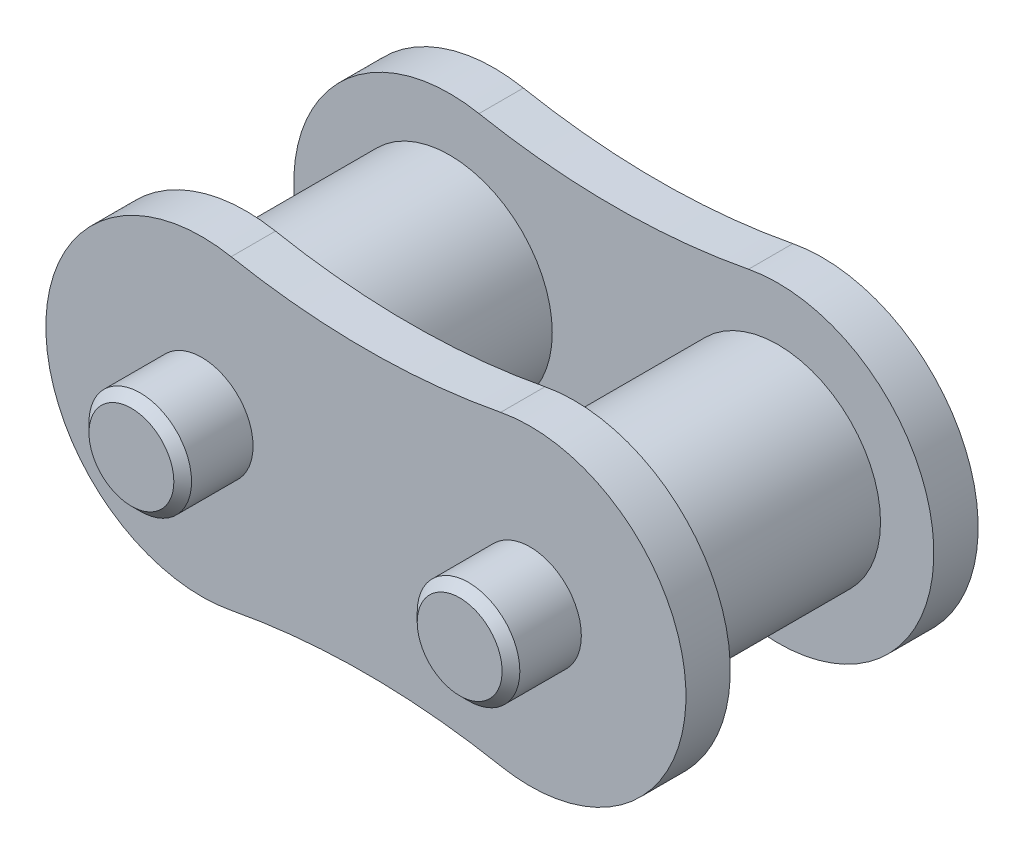
ISO-10303-21;
HEADER;
FILE_DESCRIPTION(('STEP AP214'),'2;1');
FILE_NAME('part.step','',(''),(''),'','','');
FILE_SCHEMA(('AUTOMOTIVE_DESIGN { 1 0 10303 214 1 1 1 1 }'));
ENDSEC;
DATA;
#1=APPLICATION_CONTEXT('core data for automotive mechanical design processes');
#2=APPLICATION_PROTOCOL_DEFINITION('international standard','automotive_design',2000,#1);
#3=PRODUCT_CONTEXT('',#1,'mechanical');
#4=PRODUCT('Part','Part','',(#3));
#5=PRODUCT_RELATED_PRODUCT_CATEGORY('part','',(#4));
#6=PRODUCT_DEFINITION_FORMATION('','',#4);
#7=PRODUCT_DEFINITION_CONTEXT('part definition',#1,'design');
#8=PRODUCT_DEFINITION('design','',#6,#7);
#9=PRODUCT_DEFINITION_SHAPE('','',#8);
#10=(LENGTH_UNIT() NAMED_UNIT(*) SI_UNIT(.MILLI.,.METRE.));
#11=(NAMED_UNIT(*) PLANE_ANGLE_UNIT() SI_UNIT($,.RADIAN.));
#12=(NAMED_UNIT(*) SI_UNIT($,.STERADIAN.) SOLID_ANGLE_UNIT());
#13=UNCERTAINTY_MEASURE_WITH_UNIT(LENGTH_MEASURE(1.E-05),#10,'distance_accuracy_value','');
#14=(GEOMETRIC_REPRESENTATION_CONTEXT(3) GLOBAL_UNCERTAINTY_ASSIGNED_CONTEXT((#13)) GLOBAL_UNIT_ASSIGNED_CONTEXT((#10,
#11,#12)) REPRESENTATION_CONTEXT('',''));
#15=CARTESIAN_POINT('',(0.,0.,0.));
#16=DIRECTION('',(0.,0.,1.));
#17=DIRECTION('',(1.,0.,0.));
#18=AXIS2_PLACEMENT_3D('',#15,#16,#17);
#19=CARTESIAN_POINT('',(-6.35,-33.119427631579,7.875));
#20=DIRECTION('',(0.,0.,1.));
#21=DIRECTION('',(1.,0.,0.));
#22=AXIS2_PLACEMENT_3D('',#19,#20,#21);
#23=PLANE('',#22);
#24=CARTESIAN_POINT('',(12.7,0.,7.875));
#25=DIRECTION('',(0.,0.,1.));
#26=DIRECTION('',(1.,0.,0.));
#27=AXIS2_PLACEMENT_3D('',#24,#25,#26);
#28=CIRCLE('',#27,7.94);
#29=CARTESIAN_POINT('',(20.64,0.,7.875));
#30=VERTEX_POINT('',#29);
#31=EDGE_CURVE('E176',#30,#30,#28,.T.);
#32=ORIENTED_EDGE('',*,*,#31,.T.);
#33=EDGE_LOOP('',(#32));
#34=FACE_BOUND('',#33,.T.);
#35=CARTESIAN_POINT('',(0.,-66.238855263158,7.875));
#36=DIRECTION('',(0.,0.,-1.));
#37=DIRECTION('',(1.,0.,0.));
#38=AXIS2_PLACEMENT_3D('',#35,#36,#37);
#39=CIRCLE('',#38,55.380355263158);
#40=CARTESIAN_POINT('',(-10.4281534154258,-11.8491745744655,7.875));
#41=VERTEX_POINT('',#40);
#42=CARTESIAN_POINT('',(10.4281534154258,-11.8491745744654,7.875));
#43=VERTEX_POINT('',#42);
#44=EDGE_CURVE('E155',#41,#43,#39,.T.);
#45=ORIENTED_EDGE('',*,*,#44,.F.);
#46=CARTESIAN_POINT('',(-12.7,0.,7.875));
#47=DIRECTION('',(0.,0.,1.));
#48=DIRECTION('',(1.,0.,0.));
#49=AXIS2_PLACEMENT_3D('',#46,#47,#48);
#50=CIRCLE('',#49,12.065);
#51=CARTESIAN_POINT('',(-10.4281534154258,11.8491745744655,7.875));
#52=VERTEX_POINT('',#51);
#53=EDGE_CURVE('E71',#52,#41,#50,.T.);
#54=ORIENTED_EDGE('',*,*,#53,.F.);
#55=CARTESIAN_POINT('',(0.,66.238855263158,7.875));
#56=DIRECTION('',(0.,0.,-1.));
#57=DIRECTION('',(1.,0.,0.));
#58=AXIS2_PLACEMENT_3D('',#55,#56,#57);
#59=CIRCLE('',#58,55.380355263158);
#60=CARTESIAN_POINT('',(10.4281534154258,11.8491745744655,7.875));
#61=VERTEX_POINT('',#60);
#62=EDGE_CURVE('E65',#61,#52,#59,.T.);
#63=ORIENTED_EDGE('',*,*,#62,.F.);
#64=CARTESIAN_POINT('',(12.7,0.,7.875));
#65=DIRECTION('',(0.,0.,1.));
#66=DIRECTION('',(1.,0.,0.));
#67=AXIS2_PLACEMENT_3D('',#64,#65,#66);
#68=CIRCLE('',#67,12.065);
#69=EDGE_CURVE('E165',#43,#61,#68,.T.);
#70=ORIENTED_EDGE('',*,*,#69,.F.);
#71=EDGE_LOOP('',(#45,#54,#63,#70));
#72=FACE_BOUND('',#71,.T.);
#73=CARTESIAN_POINT('',(-12.7,0.,7.875));
#74=DIRECTION('',(0.,0.,1.));
#75=DIRECTION('',(1.,0.,0.));
#76=AXIS2_PLACEMENT_3D('',#73,#74,#75);
#77=CIRCLE('',#76,7.94);
#78=CARTESIAN_POINT('',(-4.76,0.,7.875));
#79=VERTEX_POINT('',#78);
#80=EDGE_CURVE('E179',#79,#79,#77,.F.);
#81=ORIENTED_EDGE('',*,*,#80,.F.);
#82=EDGE_LOOP('',(#81));
#83=FACE_BOUND('',#82,.T.);
#84=ADVANCED_FACE('F30',(#34,#72,#83),#23,.F.);
#85=CARTESIAN_POINT('',(12.7,0.,7.875));
#86=DIRECTION('',(0.,0.,-1.));
#87=DIRECTION('',(-1.,0.,0.));
#88=AXIS2_PLACEMENT_3D('',#85,#86,#87);
#89=CYLINDRICAL_SURFACE('',#88,7.94);
#90=ORIENTED_EDGE('',*,*,#31,.F.);
#91=EDGE_LOOP('',(#90));
#92=FACE_BOUND('',#91,.T.);
#93=CARTESIAN_POINT('',(12.7,0.,-7.875));
#94=DIRECTION('',(0.,0.,-1.));
#95=DIRECTION('',(-1.,0.,0.));
#96=AXIS2_PLACEMENT_3D('',#93,#94,#95);
#97=CIRCLE('',#96,7.94);
#98=CARTESIAN_POINT('',(4.76,0.,-7.875));
#99=VERTEX_POINT('',#98);
#100=EDGE_CURVE('E152',#99,#99,#97,.T.);
#101=ORIENTED_EDGE('',*,*,#100,.F.);
#102=EDGE_LOOP('',(#101));
#103=FACE_BOUND('',#102,.T.);
#104=ADVANCED_FACE('F222',(#92,#103),#89,.T.);
#105=CARTESIAN_POINT('',(0.,-66.238855263158,11.305));
#106=DIRECTION('',(0.,0.,-1.));
#107=DIRECTION('',(-1.,0.,0.));
#108=AXIS2_PLACEMENT_3D('',#105,#106,#107);
#109=CYLINDRICAL_SURFACE('',#108,55.380355263158);
#110=ORIENTED_EDGE('',*,*,#44,.T.);
#111=DIRECTION('',(0.,0.,-1.));
#112=VECTOR('',#111,1.);
#113=CARTESIAN_POINT('',(10.4281534154258,-11.8491745744654,11.305));
#114=LINE('',#113,#112);
#115=CARTESIAN_POINT('',(10.4281534154258,-11.8491745744654,11.305));
#116=VERTEX_POINT('',#115);
#117=EDGE_CURVE('E174',#116,#43,#114,.T.);
#118=ORIENTED_EDGE('',*,*,#117,.F.);
#119=CARTESIAN_POINT('',(0.,-66.238855263158,11.305));
#120=DIRECTION('',(0.,0.,-1.));
#121=DIRECTION('',(1.,0.,0.));
#122=AXIS2_PLACEMENT_3D('',#119,#120,#121);
#123=CIRCLE('',#122,55.380355263158);
#124=CARTESIAN_POINT('',(-10.4281534154258,-11.8491745744655,11.305));
#125=VERTEX_POINT('',#124);
#126=EDGE_CURVE('E156',#125,#116,#123,.T.);
#127=ORIENTED_EDGE('',*,*,#126,.F.);
#128=DIRECTION('',(0.,0.,-1.));
#129=VECTOR('',#128,1.);
#130=CARTESIAN_POINT('',(-10.4281534154258,-11.8491745744655,11.305));
#131=LINE('',#130,#129);
#132=EDGE_CURVE('E162',#125,#41,#131,.T.);
#133=ORIENTED_EDGE('',*,*,#132,.T.);
#134=EDGE_LOOP('',(#110,#118,#127,#133));
#135=FACE_BOUND('',#134,.T.);
#136=ADVANCED_FACE('F228',(#135),#109,.F.);
#137=CARTESIAN_POINT('',(12.7,0.,11.305));
#138=DIRECTION('',(0.,0.,-1.));
#139=DIRECTION('',(-1.,0.,0.));
#140=AXIS2_PLACEMENT_3D('',#137,#138,#139);
#141=CYLINDRICAL_SURFACE('',#140,12.065);
#142=ORIENTED_EDGE('',*,*,#69,.T.);
#143=DIRECTION('',(0.,0.,-1.));
#144=VECTOR('',#143,1.);
#145=CARTESIAN_POINT('',(10.4281534154258,11.8491745744655,11.305));
#146=LINE('',#145,#144);
#147=CARTESIAN_POINT('',(10.4281534154258,11.8491745744655,11.305));
#148=VERTEX_POINT('',#147);
#149=EDGE_CURVE('E172',#148,#61,#146,.T.);
#150=ORIENTED_EDGE('',*,*,#149,.F.);
#151=CARTESIAN_POINT('',(12.7,0.,11.305));
#152=DIRECTION('',(0.,0.,1.));
#153=DIRECTION('',(1.,0.,0.));
#154=AXIS2_PLACEMENT_3D('',#151,#152,#153);
#155=CIRCLE('',#154,12.065);
#156=EDGE_CURVE('E79',#116,#148,#155,.T.);
#157=ORIENTED_EDGE('',*,*,#156,.F.);
#158=ORIENTED_EDGE('',*,*,#117,.T.);
#159=EDGE_LOOP('',(#142,#150,#157,#158));
#160=FACE_BOUND('',#159,.T.);
#161=ADVANCED_FACE('F242',(#160),#141,.T.);
#162=CARTESIAN_POINT('',(0.,66.238855263158,11.305));
#163=DIRECTION('',(0.,0.,-1.));
#164=DIRECTION('',(-1.,0.,0.));
#165=AXIS2_PLACEMENT_3D('',#162,#163,#164);
#166=CYLINDRICAL_SURFACE('',#165,55.380355263158);
#167=ORIENTED_EDGE('',*,*,#62,.T.);
#168=DIRECTION('',(0.,0.,-1.));
#169=VECTOR('',#168,1.);
#170=CARTESIAN_POINT('',(-10.4281534154258,11.8491745744655,11.305));
#171=LINE('',#170,#169);
#172=CARTESIAN_POINT('',(-10.4281534154258,11.8491745744655,11.305));
#173=VERTEX_POINT('',#172);
#174=EDGE_CURVE('E170',#173,#52,#171,.T.);
#175=ORIENTED_EDGE('',*,*,#174,.F.);
#176=CARTESIAN_POINT('',(0.,66.238855263158,11.305));
#177=DIRECTION('',(0.,0.,-1.));
#178=DIRECTION('',(1.,0.,0.));
#179=AXIS2_PLACEMENT_3D('',#176,#177,#178);
#180=CIRCLE('',#179,55.380355263158);
#181=EDGE_CURVE('E159',#148,#173,#180,.T.);
#182=ORIENTED_EDGE('',*,*,#181,.F.);
#183=ORIENTED_EDGE('',*,*,#149,.T.);
#184=EDGE_LOOP('',(#167,#175,#182,#183));
#185=FACE_BOUND('',#184,.T.);
#186=ADVANCED_FACE('F239',(#185),#166,.F.);
#187=CARTESIAN_POINT('',(-12.7,0.,11.305));
#188=DIRECTION('',(0.,0.,-1.));
#189=DIRECTION('',(-1.,0.,0.));
#190=AXIS2_PLACEMENT_3D('',#187,#188,#189);
#191=CYLINDRICAL_SURFACE('',#190,12.065);
#192=ORIENTED_EDGE('',*,*,#53,.T.);
#193=ORIENTED_EDGE('',*,*,#132,.F.);
#194=CARTESIAN_POINT('',(-12.7,0.,11.305));
#195=DIRECTION('',(0.,0.,1.));
#196=DIRECTION('',(1.,0.,0.));
#197=AXIS2_PLACEMENT_3D('',#194,#195,#196);
#198=CIRCLE('',#197,12.065);
#199=EDGE_CURVE('E47',#173,#125,#198,.T.);
#200=ORIENTED_EDGE('',*,*,#199,.F.);
#201=ORIENTED_EDGE('',*,*,#174,.T.);
#202=EDGE_LOOP('',(#192,#193,#200,#201));
#203=FACE_BOUND('',#202,.T.);
#204=ADVANCED_FACE('F236',(#203),#191,.T.);
#205=CARTESIAN_POINT('',(-6.35,-33.119427631579,11.305));
#206=DIRECTION('',(0.,0.,1.));
#207=DIRECTION('',(1.,0.,0.));
#208=AXIS2_PLACEMENT_3D('',#205,#206,#207);
#209=PLANE('',#208);
#210=CARTESIAN_POINT('',(-12.7,0.,11.305));
#211=DIRECTION('',(0.,0.,1.));
#212=DIRECTION('',(1.,0.,0.));
#213=AXIS2_PLACEMENT_3D('',#210,#211,#212);
#214=CIRCLE('',#213,3.97);
#215=CARTESIAN_POINT('',(-8.73,0.,11.305));
#216=VERTEX_POINT('',#215);
#217=EDGE_CURVE('E189',#216,#216,#214,.T.);
#218=ORIENTED_EDGE('',*,*,#217,.F.);
#219=EDGE_LOOP('',(#218));
#220=FACE_BOUND('',#219,.T.);
#221=CARTESIAN_POINT('',(12.7,0.,11.305));
#222=DIRECTION('',(0.,0.,1.));
#223=DIRECTION('',(1.,0.,0.));
#224=AXIS2_PLACEMENT_3D('',#221,#222,#223);
#225=CIRCLE('',#224,3.97);
#226=CARTESIAN_POINT('',(16.67,0.,11.305));
#227=VERTEX_POINT('',#226);
#228=EDGE_CURVE('E185',#227,#227,#225,.T.);
#229=ORIENTED_EDGE('',*,*,#228,.F.);
#230=EDGE_LOOP('',(#229));
#231=FACE_BOUND('',#230,.T.);
#232=ORIENTED_EDGE('',*,*,#126,.T.);
#233=ORIENTED_EDGE('',*,*,#156,.T.);
#234=ORIENTED_EDGE('',*,*,#181,.T.);
#235=ORIENTED_EDGE('',*,*,#199,.T.);
#236=EDGE_LOOP('',(#232,#233,#234,#235));
#237=FACE_BOUND('',#236,.T.);
#238=ADVANCED_FACE('F234',(#220,#231,#237),#209,.T.);
#239=CARTESIAN_POINT('',(-12.7,0.,7.875));
#240=DIRECTION('',(0.,0.,-1.));
#241=DIRECTION('',(-1.,0.,0.));
#242=AXIS2_PLACEMENT_3D('',#239,#240,#241);
#243=CYLINDRICAL_SURFACE('',#242,7.94);
#244=ORIENTED_EDGE('',*,*,#80,.T.);
#245=EDGE_LOOP('',(#244));
#246=FACE_BOUND('',#245,.T.);
#247=CARTESIAN_POINT('',(-12.7,0.,-7.875));
#248=DIRECTION('',(0.,0.,-1.));
#249=DIRECTION('',(-1.,0.,0.));
#250=AXIS2_PLACEMENT_3D('',#247,#248,#249);
#251=CIRCLE('',#250,7.94);
#252=CARTESIAN_POINT('',(-20.64,0.,-7.875));
#253=VERTEX_POINT('',#252);
#254=EDGE_CURVE('E117',#253,#253,#251,.T.);
#255=ORIENTED_EDGE('',*,*,#254,.F.);
#256=EDGE_LOOP('',(#255));
#257=FACE_BOUND('',#256,.T.);
#258=ADVANCED_FACE('F288',(#246,#257),#243,.T.);
#259=CARTESIAN_POINT('',(-6.35,-33.119427631579,-7.875));
#260=DIRECTION('',(0.,0.,-1.));
#261=DIRECTION('',(1.,0.,0.));
#262=AXIS2_PLACEMENT_3D('',#259,#260,#261);
#263=PLANE('',#262);
#264=ORIENTED_EDGE('',*,*,#254,.T.);
#265=EDGE_LOOP('',(#264));
#266=FACE_BOUND('',#265,.T.);
#267=CARTESIAN_POINT('',(0.,-66.238855263158,-7.875));
#268=DIRECTION('',(0.,0.,-1.));
#269=DIRECTION('',(1.,0.,0.));
#270=AXIS2_PLACEMENT_3D('',#267,#268,#269);
#271=CIRCLE('',#270,55.380355263158);
#272=CARTESIAN_POINT('',(-10.4281534154258,-11.8491745744655,-7.875));
#273=VERTEX_POINT('',#272);
#274=CARTESIAN_POINT('',(10.4281534154258,-11.8491745744654,-7.875));
#275=VERTEX_POINT('',#274);
#276=EDGE_CURVE('E112',#273,#275,#271,.T.);
#277=ORIENTED_EDGE('',*,*,#276,.T.);
#278=CARTESIAN_POINT('',(12.7,0.,-7.875));
#279=DIRECTION('',(0.,0.,1.));
#280=DIRECTION('',(1.,0.,0.));
#281=AXIS2_PLACEMENT_3D('',#278,#279,#280);
#282=CIRCLE('',#281,12.065);
#283=CARTESIAN_POINT('',(10.4281534154258,11.8491745744655,-7.875));
#284=VERTEX_POINT('',#283);
#285=EDGE_CURVE('E128',#275,#284,#282,.T.);
#286=ORIENTED_EDGE('',*,*,#285,.T.);
#287=CARTESIAN_POINT('',(0.,66.238855263158,-7.875));
#288=DIRECTION('',(0.,0.,-1.));
#289=DIRECTION('',(1.,0.,0.));
#290=AXIS2_PLACEMENT_3D('',#287,#288,#289);
#291=CIRCLE('',#290,55.380355263158);
#292=CARTESIAN_POINT('',(-10.4281534154258,11.8491745744655,-7.875));
#293=VERTEX_POINT('',#292);
#294=EDGE_CURVE('E141',#284,#293,#291,.T.);
#295=ORIENTED_EDGE('',*,*,#294,.T.);
#296=CARTESIAN_POINT('',(-12.7,0.,-7.875));
#297=DIRECTION('',(0.,0.,1.));
#298=DIRECTION('',(1.,0.,0.));
#299=AXIS2_PLACEMENT_3D('',#296,#297,#298);
#300=CIRCLE('',#299,12.065);
#301=EDGE_CURVE('E139',#293,#273,#300,.T.);
#302=ORIENTED_EDGE('',*,*,#301,.T.);
#303=EDGE_LOOP('',(#277,#286,#295,#302));
#304=FACE_BOUND('',#303,.T.);
#305=ORIENTED_EDGE('',*,*,#100,.T.);
#306=EDGE_LOOP('',(#305));
#307=FACE_BOUND('',#306,.T.);
#308=ADVANCED_FACE('F285',(#266,#304,#307),#263,.F.);
#309=CARTESIAN_POINT('',(0.,-66.238855263158,-11.305));
#310=DIRECTION('',(0.,0.,1.));
#311=DIRECTION('',(1.,0.,0.));
#312=AXIS2_PLACEMENT_3D('',#309,#310,#311);
#313=CYLINDRICAL_SURFACE('',#312,55.380355263158);
#314=ORIENTED_EDGE('',*,*,#276,.F.);
#315=DIRECTION('',(0.,0.,1.));
#316=VECTOR('',#315,1.);
#317=CARTESIAN_POINT('',(-10.4281534154258,-11.8491745744655,-11.305));
#318=LINE('',#317,#316);
#319=CARTESIAN_POINT('',(-10.4281534154258,-11.8491745744655,-11.305));
#320=VERTEX_POINT('',#319);
#321=EDGE_CURVE('E106',#320,#273,#318,.T.);
#322=ORIENTED_EDGE('',*,*,#321,.F.);
#323=CARTESIAN_POINT('',(0.,-66.238855263158,-11.305));
#324=DIRECTION('',(0.,0.,-1.));
#325=DIRECTION('',(1.,0.,0.));
#326=AXIS2_PLACEMENT_3D('',#323,#324,#325);
#327=CIRCLE('',#326,55.380355263158);
#328=CARTESIAN_POINT('',(10.4281534154258,-11.8491745744654,-11.305));
#329=VERTEX_POINT('',#328);
#330=EDGE_CURVE('E109',#320,#329,#327,.T.);
#331=ORIENTED_EDGE('',*,*,#330,.T.);
#332=DIRECTION('',(0.,0.,1.));
#333=VECTOR('',#332,1.);
#334=CARTESIAN_POINT('',(10.4281534154258,-11.8491745744654,-11.305));
#335=LINE('',#334,#333);
#336=EDGE_CURVE('E137',#329,#275,#335,.T.);
#337=ORIENTED_EDGE('',*,*,#336,.T.);
#338=EDGE_LOOP('',(#314,#322,#331,#337));
#339=FACE_BOUND('',#338,.T.);
#340=ADVANCED_FACE('F108',(#339),#313,.F.);
#341=CARTESIAN_POINT('',(-12.7,0.,-11.305));
#342=DIRECTION('',(0.,0.,1.));
#343=DIRECTION('',(1.,0.,0.));
#344=AXIS2_PLACEMENT_3D('',#341,#342,#343);
#345=CYLINDRICAL_SURFACE('',#344,12.065);
#346=ORIENTED_EDGE('',*,*,#301,.F.);
#347=DIRECTION('',(0.,0.,1.));
#348=VECTOR('',#347,1.);
#349=CARTESIAN_POINT('',(-10.4281534154258,11.8491745744655,-11.305));
#350=LINE('',#349,#348);
#351=CARTESIAN_POINT('',(-10.4281534154258,11.8491745744655,-11.305));
#352=VERTEX_POINT('',#351);
#353=EDGE_CURVE('E118',#352,#293,#350,.T.);
#354=ORIENTED_EDGE('',*,*,#353,.F.);
#355=CARTESIAN_POINT('',(-12.7,0.,-11.305));
#356=DIRECTION('',(0.,0.,1.));
#357=DIRECTION('',(1.,0.,0.));
#358=AXIS2_PLACEMENT_3D('',#355,#356,#357);
#359=CIRCLE('',#358,12.065);
#360=EDGE_CURVE('E124',#352,#320,#359,.T.);
#361=ORIENTED_EDGE('',*,*,#360,.T.);
#362=ORIENTED_EDGE('',*,*,#321,.T.);
#363=EDGE_LOOP('',(#346,#354,#361,#362));
#364=FACE_BOUND('',#363,.T.);
#365=ADVANCED_FACE('F130',(#364),#345,.T.);
#366=CARTESIAN_POINT('',(0.,66.238855263158,-11.305));
#367=DIRECTION('',(0.,0.,1.));
#368=DIRECTION('',(1.,0.,0.));
#369=AXIS2_PLACEMENT_3D('',#366,#367,#368);
#370=CYLINDRICAL_SURFACE('',#369,55.380355263158);
#371=ORIENTED_EDGE('',*,*,#294,.F.);
#372=DIRECTION('',(0.,0.,1.));
#373=VECTOR('',#372,1.);
#374=CARTESIAN_POINT('',(10.4281534154258,11.8491745744655,-11.305));
#375=LINE('',#374,#373);
#376=CARTESIAN_POINT('',(10.4281534154258,11.8491745744655,-11.305));
#377=VERTEX_POINT('',#376);
#378=EDGE_CURVE('E147',#377,#284,#375,.T.);
#379=ORIENTED_EDGE('',*,*,#378,.F.);
#380=CARTESIAN_POINT('',(0.,66.238855263158,-11.305));
#381=DIRECTION('',(0.,0.,-1.));
#382=DIRECTION('',(1.,0.,0.));
#383=AXIS2_PLACEMENT_3D('',#380,#381,#382);
#384=CIRCLE('',#383,55.380355263158);
#385=EDGE_CURVE('E131',#377,#352,#384,.T.);
#386=ORIENTED_EDGE('',*,*,#385,.T.);
#387=ORIENTED_EDGE('',*,*,#353,.T.);
#388=EDGE_LOOP('',(#371,#379,#386,#387));
#389=FACE_BOUND('',#388,.T.);
#390=ADVANCED_FACE('F292',(#389),#370,.F.);
#391=CARTESIAN_POINT('',(12.7,0.,-11.305));
#392=DIRECTION('',(0.,0.,1.));
#393=DIRECTION('',(1.,0.,0.));
#394=AXIS2_PLACEMENT_3D('',#391,#392,#393);
#395=CYLINDRICAL_SURFACE('',#394,12.065);
#396=ORIENTED_EDGE('',*,*,#285,.F.);
#397=ORIENTED_EDGE('',*,*,#336,.F.);
#398=CARTESIAN_POINT('',(12.7,0.,-11.305));
#399=DIRECTION('',(0.,0.,1.));
#400=DIRECTION('',(1.,0.,0.));
#401=AXIS2_PLACEMENT_3D('',#398,#399,#400);
#402=CIRCLE('',#401,12.065);
#403=EDGE_CURVE('E127',#329,#377,#402,.T.);
#404=ORIENTED_EDGE('',*,*,#403,.T.);
#405=ORIENTED_EDGE('',*,*,#378,.T.);
#406=EDGE_LOOP('',(#396,#397,#404,#405));
#407=FACE_BOUND('',#406,.T.);
#408=ADVANCED_FACE('F283',(#407),#395,.T.);
#409=CARTESIAN_POINT('',(-6.35,-33.119427631579,-11.305));
#410=DIRECTION('',(0.,0.,-1.));
#411=DIRECTION('',(1.,0.,0.));
#412=AXIS2_PLACEMENT_3D('',#409,#410,#411);
#413=PLANE('',#412);
#414=CARTESIAN_POINT('',(-12.7,0.,-11.305));
#415=DIRECTION('',(0.,0.,-1.));
#416=DIRECTION('',(-1.,0.,0.));
#417=AXIS2_PLACEMENT_3D('',#414,#415,#416);
#418=CIRCLE('',#417,3.97);
#419=CARTESIAN_POINT('',(-16.67,0.,-11.305));
#420=VERTEX_POINT('',#419);
#421=EDGE_CURVE('E186',#420,#420,#418,.T.);
#422=ORIENTED_EDGE('',*,*,#421,.F.);
#423=EDGE_LOOP('',(#422));
#424=FACE_BOUND('',#423,.T.);
#425=CARTESIAN_POINT('',(12.7,0.,-11.305));
#426=DIRECTION('',(0.,0.,-1.));
#427=DIRECTION('',(-1.,0.,0.));
#428=AXIS2_PLACEMENT_3D('',#425,#426,#427);
#429=CIRCLE('',#428,3.97);
#430=CARTESIAN_POINT('',(8.73,0.,-11.305));
#431=VERTEX_POINT('',#430);
#432=EDGE_CURVE('E182',#431,#431,#429,.T.);
#433=ORIENTED_EDGE('',*,*,#432,.F.);
#434=EDGE_LOOP('',(#433));
#435=FACE_BOUND('',#434,.T.);
#436=ORIENTED_EDGE('',*,*,#330,.F.);
#437=ORIENTED_EDGE('',*,*,#360,.F.);
#438=ORIENTED_EDGE('',*,*,#385,.F.);
#439=ORIENTED_EDGE('',*,*,#403,.F.);
#440=EDGE_LOOP('',(#436,#437,#438,#439));
#441=FACE_BOUND('',#440,.T.);
#442=ADVANCED_FACE('F122',(#424,#435,#441),#413,.T.);
#443=CARTESIAN_POINT('',(12.7,0.,-16.75));
#444=DIRECTION('',(0.,0.,1.));
#445=DIRECTION('',(1.,0.,0.));
#446=AXIS2_PLACEMENT_3D('',#443,#444,#445);
#447=PLANE('',#446);
#448=CARTESIAN_POINT('',(12.7,0.,-16.75));
#449=DIRECTION('',(0.,0.,1.));
#450=DIRECTION('',(1.,0.,0.));
#451=AXIS2_PLACEMENT_3D('',#448,#449,#450);
#452=CIRCLE('',#451,3.28399999999999);
#453=CARTESIAN_POINT('',(15.984,0.,-16.75));
#454=VERTEX_POINT('',#453);
#455=EDGE_CURVE('E193',#454,#454,#452,.F.);
#456=ORIENTED_EDGE('',*,*,#455,.T.);
#457=EDGE_LOOP('',(#456));
#458=FACE_BOUND('',#457,.T.);
#459=ADVANCED_FACE('F276',(#458),#447,.F.);
#460=CARTESIAN_POINT('',(12.7,0.,-16.75));
#461=DIRECTION('',(0.,0.,1.));
#462=DIRECTION('',(1.,0.,0.));
#463=AXIS2_PLACEMENT_3D('',#460,#461,#462);
#464=CYLINDRICAL_SURFACE('',#463,3.97);
#465=CARTESIAN_POINT('',(12.7,0.,-16.064));
#466=DIRECTION('',(0.,0.,1.));
#467=DIRECTION('',(1.,0.,0.));
#468=AXIS2_PLACEMENT_3D('',#465,#466,#467);
#469=CIRCLE('',#468,3.97);
#470=CARTESIAN_POINT('',(16.67,0.,-16.064));
#471=VERTEX_POINT('',#470);
#472=EDGE_CURVE('E190',#471,#471,#469,.T.);
#473=ORIENTED_EDGE('',*,*,#472,.T.);
#474=EDGE_LOOP('',(#473));
#475=FACE_BOUND('',#474,.T.);
#476=ORIENTED_EDGE('',*,*,#432,.T.);
#477=EDGE_LOOP('',(#476));
#478=FACE_BOUND('',#477,.T.);
#479=ADVANCED_FACE('F272',(#475,#478),#464,.T.);
#480=CARTESIAN_POINT('',(12.7,0.,16.064));
#481=DIRECTION('',(0.,0.,1.));
#482=DIRECTION('',(1.,0.,0.));
#483=AXIS2_PLACEMENT_3D('',#480,#481,#482);
#484=CIRCLE('',#483,3.97);
#485=CARTESIAN_POINT('',(8.73,0.,16.064));
#486=VERTEX_POINT('',#485);
#487=EDGE_CURVE('E199',#486,#486,#484,.F.);
#488=ORIENTED_EDGE('',*,*,#487,.T.);
#489=EDGE_LOOP('',(#488));
#490=FACE_BOUND('',#489,.T.);
#491=ORIENTED_EDGE('',*,*,#228,.T.);
#492=EDGE_LOOP('',(#491));
#493=FACE_BOUND('',#492,.T.);
#494=ADVANCED_FACE('F263',(#490,#493),#464,.T.);
#495=CARTESIAN_POINT('',(12.7,0.,16.75));
#496=DIRECTION('',(0.,0.,1.));
#497=DIRECTION('',(1.,0.,0.));
#498=AXIS2_PLACEMENT_3D('',#495,#496,#497);
#499=PLANE('',#498);
#500=CARTESIAN_POINT('',(12.7,0.,16.75));
#501=DIRECTION('',(0.,0.,1.));
#502=DIRECTION('',(1.,0.,0.));
#503=AXIS2_PLACEMENT_3D('',#500,#501,#502);
#504=CIRCLE('',#503,3.28399999999999);
#505=CARTESIAN_POINT('',(9.41600000000001,0.,16.75));
#506=VERTEX_POINT('',#505);
#507=EDGE_CURVE('E196',#506,#506,#504,.T.);
#508=ORIENTED_EDGE('',*,*,#507,.T.);
#509=EDGE_LOOP('',(#508));
#510=FACE_BOUND('',#509,.T.);
#511=ADVANCED_FACE('F260',(#510),#499,.T.);
#512=CARTESIAN_POINT('',(-12.7,0.,-16.75));
#513=DIRECTION('',(0.,0.,1.));
#514=DIRECTION('',(1.,0.,0.));
#515=AXIS2_PLACEMENT_3D('',#512,#513,#514);
#516=PLANE('',#515);
#517=CARTESIAN_POINT('',(-12.7,0.,-16.75));
#518=DIRECTION('',(0.,0.,1.));
#519=DIRECTION('',(1.,0.,0.));
#520=AXIS2_PLACEMENT_3D('',#517,#518,#519);
#521=CIRCLE('',#520,3.28399999999999);
#522=CARTESIAN_POINT('',(-9.41600000000001,0.,-16.75));
#523=VERTEX_POINT('',#522);
#524=EDGE_CURVE('E205',#523,#523,#521,.F.);
#525=ORIENTED_EDGE('',*,*,#524,.T.);
#526=EDGE_LOOP('',(#525));
#527=FACE_BOUND('',#526,.T.);
#528=ADVANCED_FACE('F262',(#527),#516,.F.);
#529=CARTESIAN_POINT('',(-12.7,0.,-16.75));
#530=DIRECTION('',(0.,0.,1.));
#531=DIRECTION('',(1.,0.,0.));
#532=AXIS2_PLACEMENT_3D('',#529,#530,#531);
#533=CYLINDRICAL_SURFACE('',#532,3.97);
#534=CARTESIAN_POINT('',(-12.7,0.,-16.064));
#535=DIRECTION('',(0.,0.,1.));
#536=DIRECTION('',(1.,0.,0.));
#537=AXIS2_PLACEMENT_3D('',#534,#535,#536);
#538=CIRCLE('',#537,3.97);
#539=CARTESIAN_POINT('',(-8.73,0.,-16.064));
#540=VERTEX_POINT('',#539);
#541=EDGE_CURVE('E202',#540,#540,#538,.T.);
#542=ORIENTED_EDGE('',*,*,#541,.T.);
#543=EDGE_LOOP('',(#542));
#544=FACE_BOUND('',#543,.T.);
#545=ORIENTED_EDGE('',*,*,#421,.T.);
#546=EDGE_LOOP('',(#545));
#547=FACE_BOUND('',#546,.T.);
#548=ADVANCED_FACE('F269',(#544,#547),#533,.T.);
#549=CARTESIAN_POINT('',(-12.7,0.,16.064));
#550=DIRECTION('',(0.,0.,1.));
#551=DIRECTION('',(1.,0.,0.));
#552=AXIS2_PLACEMENT_3D('',#549,#550,#551);
#553=CIRCLE('',#552,3.97);
#554=CARTESIAN_POINT('',(-8.73,0.,16.064));
#555=VERTEX_POINT('',#554);
#556=EDGE_CURVE('E11',#555,#555,#553,.F.);
#557=ORIENTED_EDGE('',*,*,#556,.T.);
#558=EDGE_LOOP('',(#557));
#559=FACE_BOUND('',#558,.T.);
#560=ORIENTED_EDGE('',*,*,#217,.T.);
#561=EDGE_LOOP('',(#560));
#562=FACE_BOUND('',#561,.T.);
#563=ADVANCED_FACE('F330',(#559,#562),#533,.T.);
#564=CARTESIAN_POINT('',(-12.7,0.,16.75));
#565=DIRECTION('',(0.,0.,1.));
#566=DIRECTION('',(1.,0.,0.));
#567=AXIS2_PLACEMENT_3D('',#564,#565,#566);
#568=PLANE('',#567);
#569=CARTESIAN_POINT('',(-12.7,0.,16.75));
#570=DIRECTION('',(0.,0.,1.));
#571=DIRECTION('',(1.,0.,0.));
#572=AXIS2_PLACEMENT_3D('',#569,#570,#571);
#573=CIRCLE('',#572,3.284);
#574=CARTESIAN_POINT('',(-9.416,0.,16.75));
#575=VERTEX_POINT('',#574);
#576=EDGE_CURVE('E39',#575,#575,#573,.T.);
#577=ORIENTED_EDGE('',*,*,#576,.T.);
#578=EDGE_LOOP('',(#577));
#579=FACE_BOUND('',#578,.T.);
#580=ADVANCED_FACE('F210',(#579),#568,.T.);
#581=CARTESIAN_POINT('',(12.7,0.,-16.064));
#582=DIRECTION('',(0.,0.,1.));
#583=DIRECTION('',(1.,0.,0.));
#584=AXIS2_PLACEMENT_3D('',#581,#582,#583);
#585=CONICAL_SURFACE('',#584,3.97,0.785398163397449);
#586=ORIENTED_EDGE('',*,*,#455,.F.);
#587=EDGE_LOOP('',(#586));
#588=FACE_BOUND('',#587,.T.);
#589=ORIENTED_EDGE('',*,*,#472,.F.);
#590=EDGE_LOOP('',(#589));
#591=FACE_BOUND('',#590,.T.);
#592=ADVANCED_FACE('F248',(#588,#591),#585,.T.);
#593=CARTESIAN_POINT('',(12.7,0.,16.75));
#594=DIRECTION('',(0.,0.,-1.));
#595=DIRECTION('',(-1.,0.,0.));
#596=AXIS2_PLACEMENT_3D('',#593,#594,#595);
#597=CONICAL_SURFACE('',#596,3.28399999999999,0.785398163397444);
#598=CARTESIAN_POINT('',(8.73,0.,16.064));
#599=CARTESIAN_POINT('',(8.73714583333333,0.,16.0711458333333));
#600=CARTESIAN_POINT('',(8.74429166666666,0.,16.0782916666667));
#601=CARTESIAN_POINT('',(8.75858333333333,0.,16.0925833333333));
#602=CARTESIAN_POINT('',(8.76572916666667,0.,16.0997291666667));
#603=CARTESIAN_POINT('',(8.78002083333333,0.,16.1140208333333));
#604=CARTESIAN_POINT('',(8.78716666666667,0.,16.1211666666667));
#605=CARTESIAN_POINT('',(8.80145833333333,0.,16.1354583333333));
#606=CARTESIAN_POINT('',(8.80860416666667,0.,16.1426041666667));
#607=CARTESIAN_POINT('',(8.82289583333333,0.,16.1568958333333));
#608=CARTESIAN_POINT('',(8.83004166666667,0.,16.1640416666667));
#609=CARTESIAN_POINT('',(8.84433333333333,0.,16.1783333333333));
#610=CARTESIAN_POINT('',(8.85147916666667,0.,16.1854791666667));
#611=CARTESIAN_POINT('',(8.86577083333333,0.,16.1997708333333));
#612=CARTESIAN_POINT('',(8.87291666666667,0.,16.2069166666667));
#613=CARTESIAN_POINT('',(8.88720833333333,0.,16.2212083333333));
#614=CARTESIAN_POINT('',(8.89435416666667,0.,16.2283541666667));
#615=CARTESIAN_POINT('',(8.90864583333333,0.,16.2426458333333));
#616=CARTESIAN_POINT('',(8.91579166666667,0.,16.2497916666667));
#617=CARTESIAN_POINT('',(8.93008333333333,0.,16.2640833333333));
#618=CARTESIAN_POINT('',(8.93722916666667,0.,16.2712291666667));
#619=CARTESIAN_POINT('',(8.95152083333333,0.,16.2855208333333));
#620=CARTESIAN_POINT('',(8.95866666666667,0.,16.2926666666667));
#621=CARTESIAN_POINT('',(8.97295833333334,0.,16.3069583333333));
#622=CARTESIAN_POINT('',(8.98010416666667,0.,16.3141041666667));
#623=CARTESIAN_POINT('',(8.99439583333334,0.,16.3283958333333));
#624=CARTESIAN_POINT('',(9.00154166666667,0.,16.3355416666667));
#625=CARTESIAN_POINT('',(9.01583333333333,0.,16.3498333333333));
#626=CARTESIAN_POINT('',(9.02297916666667,0.,16.3569791666667));
#627=CARTESIAN_POINT('',(9.03727083333333,0.,16.3712708333333));
#628=CARTESIAN_POINT('',(9.04441666666667,0.,16.3784166666667));
#629=CARTESIAN_POINT('',(9.05870833333334,0.,16.3927083333333));
#630=CARTESIAN_POINT('',(9.06585416666667,0.,16.3998541666667));
#631=CARTESIAN_POINT('',(9.08014583333334,0.,16.4141458333333));
#632=CARTESIAN_POINT('',(9.08729166666667,0.,16.4212916666667));
#633=CARTESIAN_POINT('',(9.10158333333334,0.,16.4355833333333));
#634=CARTESIAN_POINT('',(9.10872916666667,0.,16.4427291666667));
#635=CARTESIAN_POINT('',(9.12302083333334,0.,16.4570208333333));
#636=CARTESIAN_POINT('',(9.13016666666667,0.,16.4641666666667));
#637=CARTESIAN_POINT('',(9.14445833333334,0.,16.4784583333333));
#638=CARTESIAN_POINT('',(9.15160416666667,0.,16.4856041666667));
#639=CARTESIAN_POINT('',(9.16589583333334,0.,16.4998958333333));
#640=CARTESIAN_POINT('',(9.17304166666667,0.,16.5070416666667));
#641=CARTESIAN_POINT('',(9.18733333333333,0.,16.5213333333333));
#642=CARTESIAN_POINT('',(9.19447916666667,0.,16.5284791666667));
#643=CARTESIAN_POINT('',(9.20877083333334,0.,16.5427708333333));
#644=CARTESIAN_POINT('',(9.21591666666667,0.,16.5499166666667));
#645=CARTESIAN_POINT('',(9.23020833333334,0.,16.5642083333333));
#646=CARTESIAN_POINT('',(9.23735416666667,0.,16.5713541666667));
#647=CARTESIAN_POINT('',(9.25164583333334,0.,16.5856458333333));
#648=CARTESIAN_POINT('',(9.25879166666667,0.,16.5927916666667));
#649=CARTESIAN_POINT('',(9.27308333333334,0.,16.6070833333333));
#650=CARTESIAN_POINT('',(9.28022916666667,0.,16.6142291666667));
#651=CARTESIAN_POINT('',(9.29452083333334,0.,16.6285208333333));
#652=CARTESIAN_POINT('',(9.30166666666667,0.,16.6356666666667));
#653=CARTESIAN_POINT('',(9.31595833333334,0.,16.6499583333333));
#654=CARTESIAN_POINT('',(9.32310416666667,0.,16.6571041666667));
#655=CARTESIAN_POINT('',(9.33739583333334,0.,16.6713958333333));
#656=CARTESIAN_POINT('',(9.34454166666667,0.,16.6785416666667));
#657=CARTESIAN_POINT('',(9.35883333333334,0.,16.6928333333333));
#658=CARTESIAN_POINT('',(9.36597916666667,0.,16.6999791666667));
#659=CARTESIAN_POINT('',(9.38027083333334,0.,16.7142708333333));
#660=CARTESIAN_POINT('',(9.38741666666667,0.,16.7214166666667));
#661=CARTESIAN_POINT('',(9.40170833333334,0.,16.7357083333333));
#662=CARTESIAN_POINT('',(9.40885416666667,0.,16.7428541666667));
#663=CARTESIAN_POINT('',(9.41600000000001,0.,16.75));
#664=B_SPLINE_CURVE_WITH_KNOTS('',3,(#598,#599,#600,#601,#602,#603,#604,#605,#606,#607,#608,
#609,#610,#611,#612,#613,#614,#615,#616,#617,#618,#619,#620,#621,#622,#623,#624,#625,#626,#627,
#628,#629,#630,#631,#632,#633,#634,#635,#636,#637,#638,#639,#640,#641,#642,#643,#644,#645,#646,
#647,#648,#649,#650,#651,#652,#653,#654,#655,#656,#657,#658,#659,#660,#661,#662,#663),
.UNSPECIFIED.,.F.,.F.,(4,2,2,2,2,2,2,2,2,2,2,2,2,2,2,2,2,2,2,2,2,2,2,2,2,2,2,2,2,2,2,2,4),(0.,
0.0303172032433753,0.0606344064867482,0.0909516097301223,0.121268812973496,0.151586016216871,
0.181903219460243,0.212220422703619,0.24253762594699,0.272854829190363,0.303172032433739,
0.333489235677112,0.363806438920487,0.394123642163859,0.424440845407234,0.454758048650607,
0.48507525189398,0.515392455137355,0.545709658380727,0.576026861624102,0.606344064867475,
0.636661268110849,0.666978471354222,0.697295674597597,0.72761287784097,0.757930081084343,
0.788247284327717,0.81856448757109,0.848881690814465,0.879198894057838,0.909516097301213,
0.939833300544585,0.97015050378796),.UNSPECIFIED.);
#665=EDGE_CURVE('BSEAM218',#486,#506,#664,.T.);
#666=ORIENTED_EDGE('',*,*,#487,.F.);
#667=ORIENTED_EDGE('',*,*,#507,.F.);
#668=ORIENTED_EDGE('',*,*,#665,.T.);
#669=ORIENTED_EDGE('',*,*,#665,.F.);
#670=EDGE_LOOP('',(#666,#668,#667,#669));
#671=FACE_BOUND('',#670,.T.);
#672=ADVANCED_FACE('F218',(#671),#597,.T.);
#673=CARTESIAN_POINT('',(-12.7,0.,-16.064));
#674=DIRECTION('',(0.,0.,1.));
#675=DIRECTION('',(1.,0.,0.));
#676=AXIS2_PLACEMENT_3D('',#673,#674,#675);
#677=CONICAL_SURFACE('',#676,3.97,0.785398163397449);
#678=ORIENTED_EDGE('',*,*,#524,.F.);
#679=EDGE_LOOP('',(#678));
#680=FACE_BOUND('',#679,.T.);
#681=ORIENTED_EDGE('',*,*,#541,.F.);
#682=EDGE_LOOP('',(#681));
#683=FACE_BOUND('',#682,.T.);
#684=ADVANCED_FACE('F213',(#680,#683),#677,.T.);
#685=CARTESIAN_POINT('',(-12.7,0.,16.75));
#686=DIRECTION('',(0.,0.,-1.));
#687=DIRECTION('',(-1.,0.,0.));
#688=AXIS2_PLACEMENT_3D('',#685,#686,#687);
#689=CONICAL_SURFACE('',#688,3.284,0.785398163397444);
#690=ORIENTED_EDGE('',*,*,#556,.F.);
#691=EDGE_LOOP('',(#690));
#692=FACE_BOUND('',#691,.T.);
#693=ORIENTED_EDGE('',*,*,#576,.F.);
#694=EDGE_LOOP('',(#693));
#695=FACE_BOUND('',#694,.T.);
#696=ADVANCED_FACE('F32',(#692,#695),#689,.T.);
#697=CLOSED_SHELL('',(#84,#104,#136,#161,#186,#204,#238,#258,#308,#340,#365,#390,#408,#442,#459,
#479,#494,#511,#528,#548,#563,#580,#592,#672,#684,#696));
#698=MANIFOLD_SOLID_BREP('B2',#697);
#699=ADVANCED_BREP_SHAPE_REPRESENTATION('',(#18,#698),#14);
#700=SHAPE_DEFINITION_REPRESENTATION(#9,#699);
ENDSEC;
END-ISO-10303-21;
